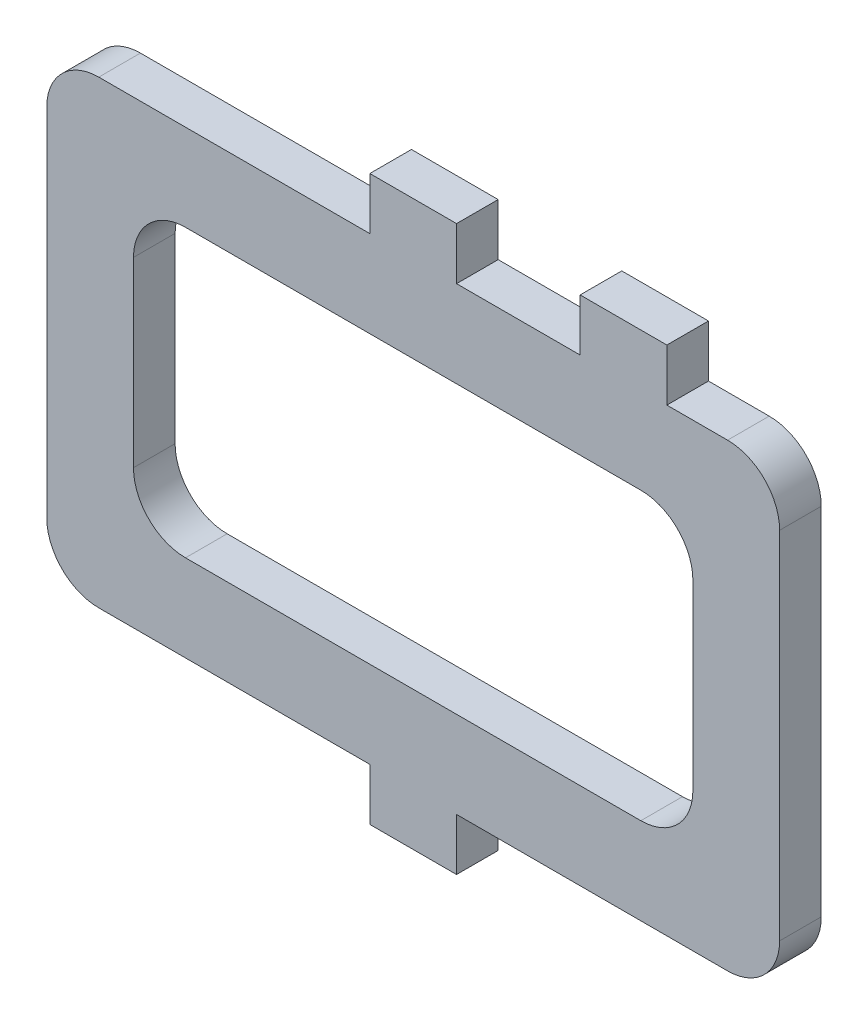
ISO-10303-21;
HEADER;
FILE_DESCRIPTION(('STEP AP214'),'2;1');
FILE_NAME('part.step','',(''),(''),'','','');
FILE_SCHEMA(('AUTOMOTIVE_DESIGN { 1 0 10303 214 1 1 1 1 }'));
ENDSEC;
DATA;
#1=APPLICATION_CONTEXT('core data for automotive mechanical design processes');
#2=APPLICATION_PROTOCOL_DEFINITION('international standard','automotive_design',2000,#1);
#3=PRODUCT_CONTEXT('',#1,'mechanical');
#4=PRODUCT('Part','Part','',(#3));
#5=PRODUCT_RELATED_PRODUCT_CATEGORY('part','',(#4));
#6=PRODUCT_DEFINITION_FORMATION('','',#4);
#7=PRODUCT_DEFINITION_CONTEXT('part definition',#1,'design');
#8=PRODUCT_DEFINITION('design','',#6,#7);
#9=PRODUCT_DEFINITION_SHAPE('','',#8);
#10=(LENGTH_UNIT() NAMED_UNIT(*) SI_UNIT(.MILLI.,.METRE.));
#11=(NAMED_UNIT(*) PLANE_ANGLE_UNIT() SI_UNIT($,.RADIAN.));
#12=(NAMED_UNIT(*) SI_UNIT($,.STERADIAN.) SOLID_ANGLE_UNIT());
#13=UNCERTAINTY_MEASURE_WITH_UNIT(LENGTH_MEASURE(1.E-05),#10,'distance_accuracy_value','');
#14=(GEOMETRIC_REPRESENTATION_CONTEXT(3) GLOBAL_UNCERTAINTY_ASSIGNED_CONTEXT((#13)) GLOBAL_UNIT_ASSIGNED_CONTEXT((#10,
#11,#12)) REPRESENTATION_CONTEXT('',''));
#15=CARTESIAN_POINT('',(0.,0.,0.));
#16=DIRECTION('',(0.,0.,1.));
#17=DIRECTION('',(1.,0.,0.));
#18=AXIS2_PLACEMENT_3D('',#15,#16,#17);
#19=CARTESIAN_POINT('',(-123.240102367902,-87.7219528240552,2.4));
#20=DIRECTION('',(0.,0.,-1.));
#21=DIRECTION('',(-1.,0.,0.));
#22=AXIS2_PLACEMENT_3D('',#19,#20,#21);
#23=CYLINDRICAL_SURFACE('',#22,3.);
#24=CARTESIAN_POINT('',(-123.240102367902,-87.7219528240552,0.));
#25=DIRECTION('',(0.,0.,1.));
#26=DIRECTION('',(1.,0.,0.));
#27=AXIS2_PLACEMENT_3D('',#24,#25,#26);
#28=CIRCLE('',#27,3.);
#29=CARTESIAN_POINT('',(-126.240102367902,-87.7219528240552,0.));
#30=VERTEX_POINT('',#29);
#31=CARTESIAN_POINT('',(-123.240102367902,-90.7219528240552,0.));
#32=VERTEX_POINT('',#31);
#33=EDGE_CURVE('E256',#30,#32,#28,.T.);
#34=ORIENTED_EDGE('',*,*,#33,.T.);
#35=DIRECTION('',(0.,0.,-1.));
#36=VECTOR('',#35,1.);
#37=CARTESIAN_POINT('',(-123.240102367902,-90.7219528240552,2.4));
#38=LINE('',#37,#36);
#39=CARTESIAN_POINT('',(-123.240102367902,-90.7219528240552,2.4));
#40=VERTEX_POINT('',#39);
#41=EDGE_CURVE('E406',#40,#32,#38,.T.);
#42=ORIENTED_EDGE('',*,*,#41,.F.);
#43=CARTESIAN_POINT('',(-123.240102367902,-87.7219528240552,2.4));
#44=DIRECTION('',(0.,0.,1.));
#45=DIRECTION('',(1.,0.,0.));
#46=AXIS2_PLACEMENT_3D('',#43,#44,#45);
#47=CIRCLE('',#46,3.);
#48=CARTESIAN_POINT('',(-126.240102367902,-87.7219528240552,2.4));
#49=VERTEX_POINT('',#48);
#50=EDGE_CURVE('E267',#49,#40,#47,.T.);
#51=ORIENTED_EDGE('',*,*,#50,.F.);
#52=DIRECTION('',(0.,0.,-1.));
#53=VECTOR('',#52,1.);
#54=CARTESIAN_POINT('',(-126.240102367902,-87.7219528240552,2.4));
#55=LINE('',#54,#53);
#56=EDGE_CURVE('E309',#49,#30,#55,.T.);
#57=ORIENTED_EDGE('',*,*,#56,.T.);
#58=EDGE_LOOP('',(#34,#42,#51,#57));
#59=FACE_BOUND('',#58,.T.);
#60=ADVANCED_FACE('F33',(#59),#23,.T.);
#61=CARTESIAN_POINT('',(-107.615102367902,-90.7219528240552,2.4));
#62=DIRECTION('',(0.,1.,0.));
#63=DIRECTION('',(0.,0.,1.));
#64=AXIS2_PLACEMENT_3D('',#61,#62,#63);
#65=PLANE('',#64);
#66=DIRECTION('',(1.,0.,0.));
#67=VECTOR('',#66,1.);
#68=CARTESIAN_POINT('',(-107.615102367902,-90.7219528240552,0.));
#69=LINE('',#68,#67);
#70=CARTESIAN_POINT('',(-107.615102367902,-90.7219528240552,0.));
#71=VERTEX_POINT('',#70);
#72=EDGE_CURVE('E312',#32,#71,#69,.T.);
#73=ORIENTED_EDGE('',*,*,#72,.T.);
#74=DIRECTION('',(0.,0.,-1.));
#75=VECTOR('',#74,1.);
#76=CARTESIAN_POINT('',(-107.615102367902,-90.7219528240552,2.4));
#77=LINE('',#76,#75);
#78=CARTESIAN_POINT('',(-107.615102367902,-90.7219528240552,2.4));
#79=VERTEX_POINT('',#78);
#80=EDGE_CURVE('E403',#79,#71,#77,.T.);
#81=ORIENTED_EDGE('',*,*,#80,.F.);
#82=DIRECTION('',(1.,0.,0.));
#83=VECTOR('',#82,1.);
#84=CARTESIAN_POINT('',(-107.615102367902,-90.7219528240552,2.4));
#85=LINE('',#84,#83);
#86=EDGE_CURVE('E270',#40,#79,#85,.T.);
#87=ORIENTED_EDGE('',*,*,#86,.F.);
#88=ORIENTED_EDGE('',*,*,#41,.T.);
#89=EDGE_LOOP('',(#73,#81,#87,#88));
#90=FACE_BOUND('',#89,.T.);
#91=ADVANCED_FACE('F457',(#90),#65,.F.);
#92=CARTESIAN_POINT('',(-107.615102367902,-90.7219528240552,2.4));
#93=DIRECTION('',(1.,0.,0.));
#94=DIRECTION('',(0.,0.,-1.));
#95=AXIS2_PLACEMENT_3D('',#92,#93,#94);
#96=PLANE('',#95);
#97=DIRECTION('',(0.,-1.,0.));
#98=VECTOR('',#97,1.);
#99=CARTESIAN_POINT('',(-107.615102367902,-90.7219528240552,0.));
#100=LINE('',#99,#98);
#101=CARTESIAN_POINT('',(-107.615102367902,-93.7219528240552,0.));
#102=VERTEX_POINT('',#101);
#103=EDGE_CURVE('E314',#71,#102,#100,.T.);
#104=ORIENTED_EDGE('',*,*,#103,.T.);
#105=DIRECTION('',(0.,0.,-1.));
#106=VECTOR('',#105,1.);
#107=CARTESIAN_POINT('',(-107.615102367902,-93.7219528240552,2.4));
#108=LINE('',#107,#106);
#109=CARTESIAN_POINT('',(-107.615102367902,-93.7219528240552,2.4));
#110=VERTEX_POINT('',#109);
#111=EDGE_CURVE('E400',#110,#102,#108,.T.);
#112=ORIENTED_EDGE('',*,*,#111,.F.);
#113=DIRECTION('',(0.,-1.,0.));
#114=VECTOR('',#113,1.);
#115=CARTESIAN_POINT('',(-107.615102367902,-90.7219528240552,2.4));
#116=LINE('',#115,#114);
#117=EDGE_CURVE('E273',#79,#110,#116,.T.);
#118=ORIENTED_EDGE('',*,*,#117,.F.);
#119=ORIENTED_EDGE('',*,*,#80,.T.);
#120=EDGE_LOOP('',(#104,#112,#118,#119));
#121=FACE_BOUND('',#120,.T.);
#122=ADVANCED_FACE('F462',(#121),#96,.F.);
#123=CARTESIAN_POINT('',(-107.615102367902,-93.7219528240552,2.4));
#124=DIRECTION('',(0.,1.,0.));
#125=DIRECTION('',(0.,0.,1.));
#126=AXIS2_PLACEMENT_3D('',#123,#124,#125);
#127=PLANE('',#126);
#128=DIRECTION('',(1.,0.,0.));
#129=VECTOR('',#128,1.);
#130=CARTESIAN_POINT('',(-107.615102367902,-93.7219528240552,0.));
#131=LINE('',#130,#129);
#132=CARTESIAN_POINT('',(-102.615102367902,-93.7219528240552,0.));
#133=VERTEX_POINT('',#132);
#134=EDGE_CURVE('E316',#102,#133,#131,.T.);
#135=ORIENTED_EDGE('',*,*,#134,.T.);
#136=DIRECTION('',(0.,0.,-1.));
#137=VECTOR('',#136,1.);
#138=CARTESIAN_POINT('',(-102.615102367902,-93.7219528240552,2.4));
#139=LINE('',#138,#137);
#140=CARTESIAN_POINT('',(-102.615102367902,-93.7219528240552,2.4));
#141=VERTEX_POINT('',#140);
#142=EDGE_CURVE('E397',#141,#133,#139,.T.);
#143=ORIENTED_EDGE('',*,*,#142,.F.);
#144=DIRECTION('',(1.,0.,0.));
#145=VECTOR('',#144,1.);
#146=CARTESIAN_POINT('',(-107.615102367902,-93.7219528240552,2.4));
#147=LINE('',#146,#145);
#148=EDGE_CURVE('E275',#110,#141,#147,.T.);
#149=ORIENTED_EDGE('',*,*,#148,.F.);
#150=ORIENTED_EDGE('',*,*,#111,.T.);
#151=EDGE_LOOP('',(#135,#143,#149,#150));
#152=FACE_BOUND('',#151,.T.);
#153=ADVANCED_FACE('F552',(#152),#127,.F.);
#154=CARTESIAN_POINT('',(-102.615102367902,-93.7219528240552,2.4));
#155=DIRECTION('',(-1.,0.,0.));
#156=DIRECTION('',(0.,0.,1.));
#157=AXIS2_PLACEMENT_3D('',#154,#155,#156);
#158=PLANE('',#157);
#159=DIRECTION('',(0.,1.,0.));
#160=VECTOR('',#159,1.);
#161=CARTESIAN_POINT('',(-102.615102367902,-93.7219528240552,0.));
#162=LINE('',#161,#160);
#163=CARTESIAN_POINT('',(-102.615102367902,-90.7219528240552,0.));
#164=VERTEX_POINT('',#163);
#165=EDGE_CURVE('E318',#133,#164,#162,.T.);
#166=ORIENTED_EDGE('',*,*,#165,.T.);
#167=DIRECTION('',(0.,0.,-1.));
#168=VECTOR('',#167,1.);
#169=CARTESIAN_POINT('',(-102.615102367902,-90.7219528240552,2.4));
#170=LINE('',#169,#168);
#171=CARTESIAN_POINT('',(-102.615102367902,-90.7219528240552,2.4));
#172=VERTEX_POINT('',#171);
#173=EDGE_CURVE('E394',#172,#164,#170,.T.);
#174=ORIENTED_EDGE('',*,*,#173,.F.);
#175=DIRECTION('',(0.,1.,0.));
#176=VECTOR('',#175,1.);
#177=CARTESIAN_POINT('',(-102.615102367902,-93.7219528240552,2.4));
#178=LINE('',#177,#176);
#179=EDGE_CURVE('E277',#141,#172,#178,.T.);
#180=ORIENTED_EDGE('',*,*,#179,.F.);
#181=ORIENTED_EDGE('',*,*,#142,.T.);
#182=EDGE_LOOP('',(#166,#174,#180,#181));
#183=FACE_BOUND('',#182,.T.);
#184=ADVANCED_FACE('F549',(#183),#158,.F.);
#185=CARTESIAN_POINT('',(-102.615102367902,-90.7219528240552,2.4));
#186=DIRECTION('',(0.,1.,0.));
#187=DIRECTION('',(0.,0.,1.));
#188=AXIS2_PLACEMENT_3D('',#185,#186,#187);
#189=PLANE('',#188);
#190=DIRECTION('',(1.,0.,0.));
#191=VECTOR('',#190,1.);
#192=CARTESIAN_POINT('',(-102.615102367902,-90.7219528240552,0.));
#193=LINE('',#192,#191);
#194=CARTESIAN_POINT('',(-86.9901023679022,-90.7219528240552,0.));
#195=VERTEX_POINT('',#194);
#196=EDGE_CURVE('E320',#164,#195,#193,.T.);
#197=ORIENTED_EDGE('',*,*,#196,.T.);
#198=DIRECTION('',(0.,0.,-1.));
#199=VECTOR('',#198,1.);
#200=CARTESIAN_POINT('',(-86.9901023679022,-90.7219528240552,2.4));
#201=LINE('',#200,#199);
#202=CARTESIAN_POINT('',(-86.9901023679022,-90.7219528240552,2.4));
#203=VERTEX_POINT('',#202);
#204=EDGE_CURVE('E391',#203,#195,#201,.T.);
#205=ORIENTED_EDGE('',*,*,#204,.F.);
#206=DIRECTION('',(1.,0.,0.));
#207=VECTOR('',#206,1.);
#208=CARTESIAN_POINT('',(-102.615102367902,-90.7219528240552,2.4));
#209=LINE('',#208,#207);
#210=EDGE_CURVE('E279',#172,#203,#209,.T.);
#211=ORIENTED_EDGE('',*,*,#210,.F.);
#212=ORIENTED_EDGE('',*,*,#173,.T.);
#213=EDGE_LOOP('',(#197,#205,#211,#212));
#214=FACE_BOUND('',#213,.T.);
#215=ADVANCED_FACE('F545',(#214),#189,.F.);
#216=CARTESIAN_POINT('',(-86.9901023679022,-87.7219528240552,2.4));
#217=DIRECTION('',(0.,0.,-1.));
#218=DIRECTION('',(-1.,0.,0.));
#219=AXIS2_PLACEMENT_3D('',#216,#217,#218);
#220=CYLINDRICAL_SURFACE('',#219,3.);
#221=CARTESIAN_POINT('',(-86.9901023679022,-87.7219528240552,0.));
#222=DIRECTION('',(0.,0.,1.));
#223=DIRECTION('',(1.,0.,0.));
#224=AXIS2_PLACEMENT_3D('',#221,#222,#223);
#225=CIRCLE('',#224,3.);
#226=CARTESIAN_POINT('',(-83.9901023679022,-87.7219528240552,0.));
#227=VERTEX_POINT('',#226);
#228=EDGE_CURVE('E322',#195,#227,#225,.T.);
#229=ORIENTED_EDGE('',*,*,#228,.T.);
#230=DIRECTION('',(0.,0.,-1.));
#231=VECTOR('',#230,1.);
#232=CARTESIAN_POINT('',(-83.9901023679022,-87.7219528240552,2.4));
#233=LINE('',#232,#231);
#234=CARTESIAN_POINT('',(-83.9901023679022,-87.7219528240552,2.4));
#235=VERTEX_POINT('',#234);
#236=EDGE_CURVE('E388',#235,#227,#233,.T.);
#237=ORIENTED_EDGE('',*,*,#236,.F.);
#238=CARTESIAN_POINT('',(-86.9901023679022,-87.7219528240552,2.4));
#239=DIRECTION('',(0.,0.,1.));
#240=DIRECTION('',(1.,0.,0.));
#241=AXIS2_PLACEMENT_3D('',#238,#239,#240);
#242=CIRCLE('',#241,3.);
#243=EDGE_CURVE('E281',#203,#235,#242,.T.);
#244=ORIENTED_EDGE('',*,*,#243,.F.);
#245=ORIENTED_EDGE('',*,*,#204,.T.);
#246=EDGE_LOOP('',(#229,#237,#244,#245));
#247=FACE_BOUND('',#246,.T.);
#248=ADVANCED_FACE('F540',(#247),#220,.T.);
#249=CARTESIAN_POINT('',(-83.9901023679022,-87.7219528240552,2.4));
#250=DIRECTION('',(-1.,0.,0.));
#251=DIRECTION('',(0.,-1.,0.));
#252=AXIS2_PLACEMENT_3D('',#249,#250,#251);
#253=PLANE('',#252);
#254=DIRECTION('',(0.,1.,0.));
#255=VECTOR('',#254,1.);
#256=CARTESIAN_POINT('',(-83.9901023679022,-87.7219528240552,0.));
#257=LINE('',#256,#255);
#258=CARTESIAN_POINT('',(-83.9901023679022,-67.2219528240552,0.));
#259=VERTEX_POINT('',#258);
#260=EDGE_CURVE('E324',#227,#259,#257,.T.);
#261=ORIENTED_EDGE('',*,*,#260,.T.);
#262=DIRECTION('',(0.,0.,-1.));
#263=VECTOR('',#262,1.);
#264=CARTESIAN_POINT('',(-83.9901023679022,-67.2219528240552,2.4));
#265=LINE('',#264,#263);
#266=CARTESIAN_POINT('',(-83.9901023679022,-67.2219528240552,2.4));
#267=VERTEX_POINT('',#266);
#268=EDGE_CURVE('E385',#267,#259,#265,.T.);
#269=ORIENTED_EDGE('',*,*,#268,.F.);
#270=DIRECTION('',(0.,1.,0.));
#271=VECTOR('',#270,1.);
#272=CARTESIAN_POINT('',(-83.9901023679022,-87.7219528240552,2.4));
#273=LINE('',#272,#271);
#274=EDGE_CURVE('E283',#235,#267,#273,.T.);
#275=ORIENTED_EDGE('',*,*,#274,.F.);
#276=ORIENTED_EDGE('',*,*,#236,.T.);
#277=EDGE_LOOP('',(#261,#269,#275,#276));
#278=FACE_BOUND('',#277,.T.);
#279=ADVANCED_FACE('F534',(#278),#253,.F.);
#280=CARTESIAN_POINT('',(-86.9901023679022,-67.2219528240552,2.4));
#281=DIRECTION('',(0.,0.,-1.));
#282=DIRECTION('',(-1.,0.,0.));
#283=AXIS2_PLACEMENT_3D('',#280,#281,#282);
#284=CYLINDRICAL_SURFACE('',#283,3.);
#285=CARTESIAN_POINT('',(-86.9901023679022,-67.2219528240552,0.));
#286=DIRECTION('',(0.,0.,1.));
#287=DIRECTION('',(1.,0.,0.));
#288=AXIS2_PLACEMENT_3D('',#285,#286,#287);
#289=CIRCLE('',#288,3.);
#290=CARTESIAN_POINT('',(-86.9901023679022,-64.2219528240552,0.));
#291=VERTEX_POINT('',#290);
#292=EDGE_CURVE('E326',#259,#291,#289,.T.);
#293=ORIENTED_EDGE('',*,*,#292,.T.);
#294=DIRECTION('',(0.,0.,-1.));
#295=VECTOR('',#294,1.);
#296=CARTESIAN_POINT('',(-86.9901023679022,-64.2219528240552,2.4));
#297=LINE('',#296,#295);
#298=CARTESIAN_POINT('',(-86.9901023679022,-64.2219528240552,2.4));
#299=VERTEX_POINT('',#298);
#300=EDGE_CURVE('E382',#299,#291,#297,.T.);
#301=ORIENTED_EDGE('',*,*,#300,.F.);
#302=CARTESIAN_POINT('',(-86.9901023679022,-67.2219528240552,2.4));
#303=DIRECTION('',(0.,0.,1.));
#304=DIRECTION('',(1.,0.,0.));
#305=AXIS2_PLACEMENT_3D('',#302,#303,#304);
#306=CIRCLE('',#305,3.);
#307=EDGE_CURVE('E285',#267,#299,#306,.T.);
#308=ORIENTED_EDGE('',*,*,#307,.F.);
#309=ORIENTED_EDGE('',*,*,#268,.T.);
#310=EDGE_LOOP('',(#293,#301,#308,#309));
#311=FACE_BOUND('',#310,.T.);
#312=ADVANCED_FACE('F530',(#311),#284,.T.);
#313=CARTESIAN_POINT('',(-90.4901023679022,-64.2219528240552,2.4));
#314=DIRECTION('',(0.,-1.,0.));
#315=DIRECTION('',(0.,0.,-1.));
#316=AXIS2_PLACEMENT_3D('',#313,#314,#315);
#317=PLANE('',#316);
#318=DIRECTION('',(-1.,0.,0.));
#319=VECTOR('',#318,1.);
#320=CARTESIAN_POINT('',(-90.4901023679022,-64.2219528240552,0.));
#321=LINE('',#320,#319);
#322=CARTESIAN_POINT('',(-90.4901023679022,-64.2219528240552,0.));
#323=VERTEX_POINT('',#322);
#324=EDGE_CURVE('E328',#291,#323,#321,.T.);
#325=ORIENTED_EDGE('',*,*,#324,.T.);
#326=DIRECTION('',(0.,0.,-1.));
#327=VECTOR('',#326,1.);
#328=CARTESIAN_POINT('',(-90.4901023679022,-64.2219528240552,2.4));
#329=LINE('',#328,#327);
#330=CARTESIAN_POINT('',(-90.4901023679022,-64.2219528240552,2.4));
#331=VERTEX_POINT('',#330);
#332=EDGE_CURVE('E379',#331,#323,#329,.T.);
#333=ORIENTED_EDGE('',*,*,#332,.F.);
#334=DIRECTION('',(-1.,0.,0.));
#335=VECTOR('',#334,1.);
#336=CARTESIAN_POINT('',(-90.4901023679022,-64.2219528240552,2.4));
#337=LINE('',#336,#335);
#338=EDGE_CURVE('E287',#299,#331,#337,.T.);
#339=ORIENTED_EDGE('',*,*,#338,.F.);
#340=ORIENTED_EDGE('',*,*,#300,.T.);
#341=EDGE_LOOP('',(#325,#333,#339,#340));
#342=FACE_BOUND('',#341,.T.);
#343=ADVANCED_FACE('F525',(#342),#317,.F.);
#344=CARTESIAN_POINT('',(-90.4901023679022,-61.2219528240552,2.4));
#345=DIRECTION('',(-1.,0.,0.));
#346=DIRECTION('',(0.,0.,1.));
#347=AXIS2_PLACEMENT_3D('',#344,#345,#346);
#348=PLANE('',#347);
#349=DIRECTION('',(0.,1.,0.));
#350=VECTOR('',#349,1.);
#351=CARTESIAN_POINT('',(-90.4901023679022,-61.2219528240552,0.));
#352=LINE('',#351,#350);
#353=CARTESIAN_POINT('',(-90.4901023679022,-61.2219528240552,0.));
#354=VERTEX_POINT('',#353);
#355=EDGE_CURVE('E330',#323,#354,#352,.T.);
#356=ORIENTED_EDGE('',*,*,#355,.T.);
#357=DIRECTION('',(0.,0.,-1.));
#358=VECTOR('',#357,1.);
#359=CARTESIAN_POINT('',(-90.4901023679022,-61.2219528240552,2.4));
#360=LINE('',#359,#358);
#361=CARTESIAN_POINT('',(-90.4901023679022,-61.2219528240552,2.4));
#362=VERTEX_POINT('',#361);
#363=EDGE_CURVE('E376',#362,#354,#360,.T.);
#364=ORIENTED_EDGE('',*,*,#363,.F.);
#365=DIRECTION('',(0.,1.,0.));
#366=VECTOR('',#365,1.);
#367=CARTESIAN_POINT('',(-90.4901023679022,-61.2219528240552,2.4));
#368=LINE('',#367,#366);
#369=EDGE_CURVE('E289',#331,#362,#368,.T.);
#370=ORIENTED_EDGE('',*,*,#369,.F.);
#371=ORIENTED_EDGE('',*,*,#332,.T.);
#372=EDGE_LOOP('',(#356,#364,#370,#371));
#373=FACE_BOUND('',#372,.T.);
#374=ADVANCED_FACE('F519',(#373),#348,.F.);
#375=CARTESIAN_POINT('',(-95.4901023679022,-61.2219528240552,2.4));
#376=DIRECTION('',(0.,-1.,0.));
#377=DIRECTION('',(0.,0.,-1.));
#378=AXIS2_PLACEMENT_3D('',#375,#376,#377);
#379=PLANE('',#378);
#380=DIRECTION('',(-1.,0.,0.));
#381=VECTOR('',#380,1.);
#382=CARTESIAN_POINT('',(-95.4901023679022,-61.2219528240552,0.));
#383=LINE('',#382,#381);
#384=CARTESIAN_POINT('',(-95.4901023679022,-61.2219528240552,0.));
#385=VERTEX_POINT('',#384);
#386=EDGE_CURVE('E332',#354,#385,#383,.T.);
#387=ORIENTED_EDGE('',*,*,#386,.T.);
#388=DIRECTION('',(0.,0.,-1.));
#389=VECTOR('',#388,1.);
#390=CARTESIAN_POINT('',(-95.4901023679022,-61.2219528240552,2.4));
#391=LINE('',#390,#389);
#392=CARTESIAN_POINT('',(-95.4901023679022,-61.2219528240552,2.4));
#393=VERTEX_POINT('',#392);
#394=EDGE_CURVE('E373',#393,#385,#391,.T.);
#395=ORIENTED_EDGE('',*,*,#394,.F.);
#396=DIRECTION('',(-1.,0.,0.));
#397=VECTOR('',#396,1.);
#398=CARTESIAN_POINT('',(-95.4901023679022,-61.2219528240552,2.4));
#399=LINE('',#398,#397);
#400=EDGE_CURVE('E291',#362,#393,#399,.T.);
#401=ORIENTED_EDGE('',*,*,#400,.F.);
#402=ORIENTED_EDGE('',*,*,#363,.T.);
#403=EDGE_LOOP('',(#387,#395,#401,#402));
#404=FACE_BOUND('',#403,.T.);
#405=ADVANCED_FACE('F515',(#404),#379,.F.);
#406=CARTESIAN_POINT('',(-95.4901023679022,-61.2219528240552,2.4));
#407=DIRECTION('',(1.,0.,0.));
#408=DIRECTION('',(0.,0.,-1.));
#409=AXIS2_PLACEMENT_3D('',#406,#407,#408);
#410=PLANE('',#409);
#411=DIRECTION('',(0.,-1.,0.));
#412=VECTOR('',#411,1.);
#413=CARTESIAN_POINT('',(-95.4901023679022,-61.2219528240552,0.));
#414=LINE('',#413,#412);
#415=CARTESIAN_POINT('',(-95.4901023679022,-64.2219528240552,0.));
#416=VERTEX_POINT('',#415);
#417=EDGE_CURVE('E334',#385,#416,#414,.T.);
#418=ORIENTED_EDGE('',*,*,#417,.T.);
#419=DIRECTION('',(0.,0.,-1.));
#420=VECTOR('',#419,1.);
#421=CARTESIAN_POINT('',(-95.4901023679022,-64.2219528240552,2.4));
#422=LINE('',#421,#420);
#423=CARTESIAN_POINT('',(-95.4901023679022,-64.2219528240552,2.4));
#424=VERTEX_POINT('',#423);
#425=EDGE_CURVE('E370',#424,#416,#422,.T.);
#426=ORIENTED_EDGE('',*,*,#425,.F.);
#427=DIRECTION('',(0.,-1.,0.));
#428=VECTOR('',#427,1.);
#429=CARTESIAN_POINT('',(-95.4901023679022,-61.2219528240552,2.4));
#430=LINE('',#429,#428);
#431=EDGE_CURVE('E293',#393,#424,#430,.T.);
#432=ORIENTED_EDGE('',*,*,#431,.F.);
#433=ORIENTED_EDGE('',*,*,#394,.T.);
#434=EDGE_LOOP('',(#418,#426,#432,#433));
#435=FACE_BOUND('',#434,.T.);
#436=ADVANCED_FACE('F510',(#435),#410,.F.);
#437=CARTESIAN_POINT('',(-95.4901023679022,-64.2219528240552,2.4));
#438=DIRECTION('',(0.,-1.,0.));
#439=DIRECTION('',(0.,0.,-1.));
#440=AXIS2_PLACEMENT_3D('',#437,#438,#439);
#441=PLANE('',#440);
#442=DIRECTION('',(-1.,0.,0.));
#443=VECTOR('',#442,1.);
#444=CARTESIAN_POINT('',(-95.4901023679022,-64.2219528240552,0.));
#445=LINE('',#444,#443);
#446=CARTESIAN_POINT('',(-102.615102367902,-64.2219528240552,0.));
#447=VERTEX_POINT('',#446);
#448=EDGE_CURVE('E336',#416,#447,#445,.T.);
#449=ORIENTED_EDGE('',*,*,#448,.T.);
#450=DIRECTION('',(0.,0.,-1.));
#451=VECTOR('',#450,1.);
#452=CARTESIAN_POINT('',(-102.615102367902,-64.2219528240552,2.4));
#453=LINE('',#452,#451);
#454=CARTESIAN_POINT('',(-102.615102367902,-64.2219528240552,2.4));
#455=VERTEX_POINT('',#454);
#456=EDGE_CURVE('E367',#455,#447,#453,.T.);
#457=ORIENTED_EDGE('',*,*,#456,.F.);
#458=DIRECTION('',(-1.,0.,0.));
#459=VECTOR('',#458,1.);
#460=CARTESIAN_POINT('',(-95.4901023679022,-64.2219528240552,2.4));
#461=LINE('',#460,#459);
#462=EDGE_CURVE('E295',#424,#455,#461,.T.);
#463=ORIENTED_EDGE('',*,*,#462,.F.);
#464=ORIENTED_EDGE('',*,*,#425,.T.);
#465=EDGE_LOOP('',(#449,#457,#463,#464));
#466=FACE_BOUND('',#465,.T.);
#467=ADVANCED_FACE('F504',(#466),#441,.F.);
#468=CARTESIAN_POINT('',(-102.615102367902,-61.2219528240552,2.4));
#469=DIRECTION('',(-1.,0.,0.));
#470=DIRECTION('',(0.,0.,1.));
#471=AXIS2_PLACEMENT_3D('',#468,#469,#470);
#472=PLANE('',#471);
#473=DIRECTION('',(0.,1.,0.));
#474=VECTOR('',#473,1.);
#475=CARTESIAN_POINT('',(-102.615102367902,-61.2219528240552,0.));
#476=LINE('',#475,#474);
#477=CARTESIAN_POINT('',(-102.615102367902,-61.2219528240552,0.));
#478=VERTEX_POINT('',#477);
#479=EDGE_CURVE('E338',#447,#478,#476,.T.);
#480=ORIENTED_EDGE('',*,*,#479,.T.);
#481=DIRECTION('',(0.,0.,-1.));
#482=VECTOR('',#481,1.);
#483=CARTESIAN_POINT('',(-102.615102367902,-61.2219528240552,2.4));
#484=LINE('',#483,#482);
#485=CARTESIAN_POINT('',(-102.615102367902,-61.2219528240552,2.4));
#486=VERTEX_POINT('',#485);
#487=EDGE_CURVE('E364',#486,#478,#484,.T.);
#488=ORIENTED_EDGE('',*,*,#487,.F.);
#489=DIRECTION('',(0.,1.,0.));
#490=VECTOR('',#489,1.);
#491=CARTESIAN_POINT('',(-102.615102367902,-61.2219528240552,2.4));
#492=LINE('',#491,#490);
#493=EDGE_CURVE('E297',#455,#486,#492,.T.);
#494=ORIENTED_EDGE('',*,*,#493,.F.);
#495=ORIENTED_EDGE('',*,*,#456,.T.);
#496=EDGE_LOOP('',(#480,#488,#494,#495));
#497=FACE_BOUND('',#496,.T.);
#498=ADVANCED_FACE('F499',(#497),#472,.F.);
#499=CARTESIAN_POINT('',(-107.615102367902,-61.2219528240552,2.4));
#500=DIRECTION('',(0.,-1.,0.));
#501=DIRECTION('',(0.,0.,-1.));
#502=AXIS2_PLACEMENT_3D('',#499,#500,#501);
#503=PLANE('',#502);
#504=DIRECTION('',(-1.,0.,0.));
#505=VECTOR('',#504,1.);
#506=CARTESIAN_POINT('',(-107.615102367902,-61.2219528240552,0.));
#507=LINE('',#506,#505);
#508=CARTESIAN_POINT('',(-107.615102367902,-61.2219528240552,0.));
#509=VERTEX_POINT('',#508);
#510=EDGE_CURVE('E341',#478,#509,#507,.T.);
#511=ORIENTED_EDGE('',*,*,#510,.T.);
#512=DIRECTION('',(0.,0.,-1.));
#513=VECTOR('',#512,1.);
#514=CARTESIAN_POINT('',(-107.615102367902,-61.2219528240552,2.4));
#515=LINE('',#514,#513);
#516=CARTESIAN_POINT('',(-107.615102367902,-61.2219528240552,2.4));
#517=VERTEX_POINT('',#516);
#518=EDGE_CURVE('E361',#517,#509,#515,.T.);
#519=ORIENTED_EDGE('',*,*,#518,.F.);
#520=DIRECTION('',(-1.,0.,0.));
#521=VECTOR('',#520,1.);
#522=CARTESIAN_POINT('',(-105.115102367902,-61.2219528240552,2.4));
#523=LINE('',#522,#521);
#524=EDGE_CURVE('E299',#486,#517,#523,.T.);
#525=ORIENTED_EDGE('',*,*,#524,.F.);
#526=ORIENTED_EDGE('',*,*,#487,.T.);
#527=EDGE_LOOP('',(#511,#519,#525,#526));
#528=FACE_BOUND('',#527,.T.);
#529=ADVANCED_FACE('F494',(#528),#503,.F.);
#530=CARTESIAN_POINT('',(-107.615102367902,-61.2219528240552,2.4));
#531=DIRECTION('',(1.,0.,0.));
#532=DIRECTION('',(0.,0.,-1.));
#533=AXIS2_PLACEMENT_3D('',#530,#531,#532);
#534=PLANE('',#533);
#535=DIRECTION('',(0.,-1.,0.));
#536=VECTOR('',#535,1.);
#537=CARTESIAN_POINT('',(-107.615102367902,-61.2219528240552,0.));
#538=LINE('',#537,#536);
#539=CARTESIAN_POINT('',(-107.615102367902,-64.2219528240552,0.));
#540=VERTEX_POINT('',#539);
#541=EDGE_CURVE('E343',#509,#540,#538,.T.);
#542=ORIENTED_EDGE('',*,*,#541,.T.);
#543=DIRECTION('',(0.,0.,-1.));
#544=VECTOR('',#543,1.);
#545=CARTESIAN_POINT('',(-107.615102367902,-64.2219528240552,2.4));
#546=LINE('',#545,#544);
#547=CARTESIAN_POINT('',(-107.615102367902,-64.2219528240552,2.4));
#548=VERTEX_POINT('',#547);
#549=EDGE_CURVE('E358',#548,#540,#546,.T.);
#550=ORIENTED_EDGE('',*,*,#549,.F.);
#551=DIRECTION('',(0.,-1.,0.));
#552=VECTOR('',#551,1.);
#553=CARTESIAN_POINT('',(-107.615102367902,-61.2219528240552,2.4));
#554=LINE('',#553,#552);
#555=EDGE_CURVE('E301',#517,#548,#554,.T.);
#556=ORIENTED_EDGE('',*,*,#555,.F.);
#557=ORIENTED_EDGE('',*,*,#518,.T.);
#558=EDGE_LOOP('',(#542,#550,#556,#557));
#559=FACE_BOUND('',#558,.T.);
#560=ADVANCED_FACE('F490',(#559),#534,.F.);
#561=CARTESIAN_POINT('',(-123.240102367902,-64.2219528240552,2.4));
#562=DIRECTION('',(0.,-1.,0.));
#563=DIRECTION('',(0.,0.,-1.));
#564=AXIS2_PLACEMENT_3D('',#561,#562,#563);
#565=PLANE('',#564);
#566=DIRECTION('',(-1.,0.,0.));
#567=VECTOR('',#566,1.);
#568=CARTESIAN_POINT('',(-123.240102367902,-64.2219528240552,0.));
#569=LINE('',#568,#567);
#570=CARTESIAN_POINT('',(-123.240102367902,-64.2219528240552,0.));
#571=VERTEX_POINT('',#570);
#572=EDGE_CURVE('E345',#540,#571,#569,.T.);
#573=ORIENTED_EDGE('',*,*,#572,.T.);
#574=DIRECTION('',(0.,0.,-1.));
#575=VECTOR('',#574,1.);
#576=CARTESIAN_POINT('',(-123.240102367902,-64.2219528240552,2.4));
#577=LINE('',#576,#575);
#578=CARTESIAN_POINT('',(-123.240102367902,-64.2219528240552,2.4));
#579=VERTEX_POINT('',#578);
#580=EDGE_CURVE('E355',#579,#571,#577,.T.);
#581=ORIENTED_EDGE('',*,*,#580,.F.);
#582=DIRECTION('',(-1.,0.,0.));
#583=VECTOR('',#582,1.);
#584=CARTESIAN_POINT('',(-123.240102367902,-64.2219528240552,2.4));
#585=LINE('',#584,#583);
#586=EDGE_CURVE('E303',#548,#579,#585,.T.);
#587=ORIENTED_EDGE('',*,*,#586,.F.);
#588=ORIENTED_EDGE('',*,*,#549,.T.);
#589=EDGE_LOOP('',(#573,#581,#587,#588));
#590=FACE_BOUND('',#589,.T.);
#591=ADVANCED_FACE('F485',(#590),#565,.F.);
#592=CARTESIAN_POINT('',(-123.240102367902,-67.2219528240552,2.4));
#593=DIRECTION('',(0.,0.,-1.));
#594=DIRECTION('',(-1.,0.,0.));
#595=AXIS2_PLACEMENT_3D('',#592,#593,#594);
#596=CYLINDRICAL_SURFACE('',#595,3.);
#597=CARTESIAN_POINT('',(-123.240102367902,-67.2219528240552,0.));
#598=DIRECTION('',(0.,0.,1.));
#599=DIRECTION('',(-1.,0.,0.));
#600=AXIS2_PLACEMENT_3D('',#597,#598,#599);
#601=CIRCLE('',#600,3.);
#602=CARTESIAN_POINT('',(-126.240102367902,-67.2219528240552,0.));
#603=VERTEX_POINT('',#602);
#604=EDGE_CURVE('E347',#571,#603,#601,.T.);
#605=ORIENTED_EDGE('',*,*,#604,.T.);
#606=DIRECTION('',(0.,0.,-1.));
#607=VECTOR('',#606,1.);
#608=CARTESIAN_POINT('',(-126.240102367902,-67.2219528240552,2.4));
#609=LINE('',#608,#607);
#610=CARTESIAN_POINT('',(-126.240102367902,-67.2219528240552,2.4));
#611=VERTEX_POINT('',#610);
#612=EDGE_CURVE('E352',#611,#603,#609,.T.);
#613=ORIENTED_EDGE('',*,*,#612,.F.);
#614=CARTESIAN_POINT('',(-123.240102367902,-67.2219528240552,2.4));
#615=DIRECTION('',(0.,0.,1.));
#616=DIRECTION('',(-1.,0.,0.));
#617=AXIS2_PLACEMENT_3D('',#614,#615,#616);
#618=CIRCLE('',#617,3.);
#619=EDGE_CURVE('E305',#579,#611,#618,.T.);
#620=ORIENTED_EDGE('',*,*,#619,.F.);
#621=ORIENTED_EDGE('',*,*,#580,.T.);
#622=EDGE_LOOP('',(#605,#613,#620,#621));
#623=FACE_BOUND('',#622,.T.);
#624=ADVANCED_FACE('F480',(#623),#596,.T.);
#625=CARTESIAN_POINT('',(-126.240102367902,-87.7219528240552,2.4));
#626=DIRECTION('',(1.,0.,0.));
#627=DIRECTION('',(0.,0.,-1.));
#628=AXIS2_PLACEMENT_3D('',#625,#626,#627);
#629=PLANE('',#628);
#630=DIRECTION('',(0.,-1.,0.));
#631=VECTOR('',#630,1.);
#632=CARTESIAN_POINT('',(-126.240102367902,-87.7219528240552,0.));
#633=LINE('',#632,#631);
#634=EDGE_CURVE('E271',#603,#30,#633,.T.);
#635=ORIENTED_EDGE('',*,*,#634,.T.);
#636=ORIENTED_EDGE('',*,*,#56,.F.);
#637=DIRECTION('',(0.,-1.,0.));
#638=VECTOR('',#637,1.);
#639=CARTESIAN_POINT('',(-126.240102367902,-87.7219528240552,2.4));
#640=LINE('',#639,#638);
#641=EDGE_CURVE('E307',#611,#49,#640,.T.);
#642=ORIENTED_EDGE('',*,*,#641,.F.);
#643=ORIENTED_EDGE('',*,*,#612,.T.);
#644=EDGE_LOOP('',(#635,#636,#642,#643));
#645=FACE_BOUND('',#644,.T.);
#646=ADVANCED_FACE('F478',(#645),#629,.F.);
#647=CARTESIAN_POINT('',(-123.240102367902,-87.7219528240552,2.4));
#648=DIRECTION('',(0.,0.,1.));
#649=DIRECTION('',(1.,0.,0.));
#650=AXIS2_PLACEMENT_3D('',#647,#648,#649);
#651=PLANE('',#650);
#652=CARTESIAN_POINT('',(-118.240102367902,-82.7219528240552,2.4));
#653=DIRECTION('',(0.,0.,1.));
#654=DIRECTION('',(-1.,0.,0.));
#655=AXIS2_PLACEMENT_3D('',#652,#653,#654);
#656=CIRCLE('',#655,3.);
#657=CARTESIAN_POINT('',(-121.240102367902,-82.7219528240552,2.4));
#658=VERTEX_POINT('',#657);
#659=CARTESIAN_POINT('',(-118.240102367902,-85.7219528240552,2.4));
#660=VERTEX_POINT('',#659);
#661=EDGE_CURVE('E47',#658,#660,#656,.T.);
#662=ORIENTED_EDGE('',*,*,#661,.F.);
#663=DIRECTION('',(0.,-1.,0.));
#664=VECTOR('',#663,1.);
#665=CARTESIAN_POINT('',(-121.240102367902,-82.7219528240552,2.4));
#666=LINE('',#665,#664);
#667=CARTESIAN_POINT('',(-121.240102367902,-72.2219528240552,2.4));
#668=VERTEX_POINT('',#667);
#669=EDGE_CURVE('E251',#668,#658,#666,.T.);
#670=ORIENTED_EDGE('',*,*,#669,.F.);
#671=CARTESIAN_POINT('',(-118.240102367902,-72.2219528240552,2.4));
#672=DIRECTION('',(0.,0.,1.));
#673=DIRECTION('',(-1.,0.,0.));
#674=AXIS2_PLACEMENT_3D('',#671,#672,#673);
#675=CIRCLE('',#674,3.);
#676=CARTESIAN_POINT('',(-118.240102367902,-69.2219528240552,2.4));
#677=VERTEX_POINT('',#676);
#678=EDGE_CURVE('E248',#677,#668,#675,.T.);
#679=ORIENTED_EDGE('',*,*,#678,.F.);
#680=DIRECTION('',(-1.,0.,0.));
#681=VECTOR('',#680,1.);
#682=CARTESIAN_POINT('',(-118.240102367902,-69.2219528240552,2.4));
#683=LINE('',#682,#681);
#684=CARTESIAN_POINT('',(-91.9901023679022,-69.2219528240552,2.4));
#685=VERTEX_POINT('',#684);
#686=EDGE_CURVE('E245',#685,#677,#683,.T.);
#687=ORIENTED_EDGE('',*,*,#686,.F.);
#688=CARTESIAN_POINT('',(-91.9901023679022,-72.2219528240552,2.4));
#689=DIRECTION('',(0.,0.,1.));
#690=DIRECTION('',(-1.,0.,0.));
#691=AXIS2_PLACEMENT_3D('',#688,#689,#690);
#692=CIRCLE('',#691,3.);
#693=CARTESIAN_POINT('',(-88.9901023679022,-72.2219528240552,2.4));
#694=VERTEX_POINT('',#693);
#695=EDGE_CURVE('E239',#694,#685,#692,.T.);
#696=ORIENTED_EDGE('',*,*,#695,.F.);
#697=DIRECTION('',(0.,1.,0.));
#698=VECTOR('',#697,1.);
#699=CARTESIAN_POINT('',(-88.9901023679022,-72.2219528240552,2.4));
#700=LINE('',#699,#698);
#701=CARTESIAN_POINT('',(-88.9901023679022,-82.7219528240552,2.4));
#702=VERTEX_POINT('',#701);
#703=EDGE_CURVE('E237',#702,#694,#700,.T.);
#704=ORIENTED_EDGE('',*,*,#703,.F.);
#705=CARTESIAN_POINT('',(-91.9901023679022,-82.7219528240552,2.4));
#706=DIRECTION('',(0.,0.,1.));
#707=DIRECTION('',(-1.,0.,0.));
#708=AXIS2_PLACEMENT_3D('',#705,#706,#707);
#709=CIRCLE('',#708,3.);
#710=CARTESIAN_POINT('',(-91.9901023679022,-85.7219528240552,2.4));
#711=VERTEX_POINT('',#710);
#712=EDGE_CURVE('E220',#711,#702,#709,.T.);
#713=ORIENTED_EDGE('',*,*,#712,.F.);
#714=DIRECTION('',(1.,0.,0.));
#715=VECTOR('',#714,1.);
#716=CARTESIAN_POINT('',(-91.9901023679022,-85.7219528240552,2.4));
#717=LINE('',#716,#715);
#718=EDGE_CURVE('E229',#660,#711,#717,.T.);
#719=ORIENTED_EDGE('',*,*,#718,.F.);
#720=EDGE_LOOP('',(#662,#670,#679,#687,#696,#704,#713,#719));
#721=FACE_BOUND('',#720,.T.);
#722=ORIENTED_EDGE('',*,*,#50,.T.);
#723=ORIENTED_EDGE('',*,*,#86,.T.);
#724=ORIENTED_EDGE('',*,*,#117,.T.);
#725=ORIENTED_EDGE('',*,*,#148,.T.);
#726=ORIENTED_EDGE('',*,*,#179,.T.);
#727=ORIENTED_EDGE('',*,*,#210,.T.);
#728=ORIENTED_EDGE('',*,*,#243,.T.);
#729=ORIENTED_EDGE('',*,*,#274,.T.);
#730=ORIENTED_EDGE('',*,*,#307,.T.);
#731=ORIENTED_EDGE('',*,*,#338,.T.);
#732=ORIENTED_EDGE('',*,*,#369,.T.);
#733=ORIENTED_EDGE('',*,*,#400,.T.);
#734=ORIENTED_EDGE('',*,*,#431,.T.);
#735=ORIENTED_EDGE('',*,*,#462,.T.);
#736=ORIENTED_EDGE('',*,*,#493,.T.);
#737=ORIENTED_EDGE('',*,*,#524,.T.);
#738=ORIENTED_EDGE('',*,*,#555,.T.);
#739=ORIENTED_EDGE('',*,*,#586,.T.);
#740=ORIENTED_EDGE('',*,*,#619,.T.);
#741=ORIENTED_EDGE('',*,*,#641,.T.);
#742=EDGE_LOOP('',(#722,#723,#724,#725,#726,#727,#728,#729,#730,#731,#732,#733,#734,#735,#736,
#737,#738,#739,#740,#741));
#743=FACE_BOUND('',#742,.T.);
#744=ADVANCED_FACE('F233',(#721,#743),#651,.T.);
#745=CARTESIAN_POINT('',(-123.240102367902,-87.7219528240552,0.));
#746=DIRECTION('',(0.,0.,1.));
#747=DIRECTION('',(1.,0.,0.));
#748=AXIS2_PLACEMENT_3D('',#745,#746,#747);
#749=PLANE('',#748);
#750=DIRECTION('',(0.,-1.,0.));
#751=VECTOR('',#750,1.);
#752=CARTESIAN_POINT('',(-121.240102367902,-87.7219528240552,0.));
#753=LINE('',#752,#751);
#754=CARTESIAN_POINT('',(-121.240102367902,-72.2219528240552,0.));
#755=VERTEX_POINT('',#754);
#756=CARTESIAN_POINT('',(-121.240102367902,-82.7219528240552,0.));
#757=VERTEX_POINT('',#756);
#758=EDGE_CURVE('E40',#755,#757,#753,.T.);
#759=ORIENTED_EDGE('',*,*,#758,.T.);
#760=CARTESIAN_POINT('',(-118.240102367902,-82.7219528240552,0.));
#761=DIRECTION('',(0.,0.,1.));
#762=DIRECTION('',(1.,0.,0.));
#763=AXIS2_PLACEMENT_3D('',#760,#761,#762);
#764=CIRCLE('',#763,3.);
#765=CARTESIAN_POINT('',(-118.240102367902,-85.7219528240552,0.));
#766=VERTEX_POINT('',#765);
#767=EDGE_CURVE('E11',#757,#766,#764,.T.);
#768=ORIENTED_EDGE('',*,*,#767,.T.);
#769=DIRECTION('',(1.,0.,0.));
#770=VECTOR('',#769,1.);
#771=CARTESIAN_POINT('',(-123.240102367902,-85.7219528240552,0.));
#772=LINE('',#771,#770);
#773=CARTESIAN_POINT('',(-91.9901023679022,-85.7219528240552,0.));
#774=VERTEX_POINT('',#773);
#775=EDGE_CURVE('E409',#766,#774,#772,.T.);
#776=ORIENTED_EDGE('',*,*,#775,.T.);
#777=CARTESIAN_POINT('',(-91.9901023679022,-82.7219528240552,0.));
#778=DIRECTION('',(0.,0.,1.));
#779=DIRECTION('',(1.,0.,0.));
#780=AXIS2_PLACEMENT_3D('',#777,#778,#779);
#781=CIRCLE('',#780,3.);
#782=CARTESIAN_POINT('',(-88.9901023679022,-82.7219528240552,0.));
#783=VERTEX_POINT('',#782);
#784=EDGE_CURVE('E223',#774,#783,#781,.T.);
#785=ORIENTED_EDGE('',*,*,#784,.T.);
#786=DIRECTION('',(0.,1.,0.));
#787=VECTOR('',#786,1.);
#788=CARTESIAN_POINT('',(-88.9901023679022,-87.7219528240552,0.));
#789=LINE('',#788,#787);
#790=CARTESIAN_POINT('',(-88.9901023679022,-72.2219528240552,0.));
#791=VERTEX_POINT('',#790);
#792=EDGE_CURVE('E412',#783,#791,#789,.T.);
#793=ORIENTED_EDGE('',*,*,#792,.T.);
#794=CARTESIAN_POINT('',(-91.9901023679022,-72.2219528240552,0.));
#795=DIRECTION('',(0.,0.,1.));
#796=DIRECTION('',(1.,0.,0.));
#797=AXIS2_PLACEMENT_3D('',#794,#795,#796);
#798=CIRCLE('',#797,3.);
#799=CARTESIAN_POINT('',(-91.9901023679022,-69.2219528240552,0.));
#800=VERTEX_POINT('',#799);
#801=EDGE_CURVE('E415',#791,#800,#798,.T.);
#802=ORIENTED_EDGE('',*,*,#801,.T.);
#803=DIRECTION('',(-1.,0.,0.));
#804=VECTOR('',#803,1.);
#805=CARTESIAN_POINT('',(-123.240102367902,-69.2219528240552,0.));
#806=LINE('',#805,#804);
#807=CARTESIAN_POINT('',(-118.240102367902,-69.2219528240552,0.));
#808=VERTEX_POINT('',#807);
#809=EDGE_CURVE('E418',#800,#808,#806,.T.);
#810=ORIENTED_EDGE('',*,*,#809,.T.);
#811=CARTESIAN_POINT('',(-118.240102367902,-72.2219528240552,0.));
#812=DIRECTION('',(0.,0.,1.));
#813=DIRECTION('',(1.,0.,0.));
#814=AXIS2_PLACEMENT_3D('',#811,#812,#813);
#815=CIRCLE('',#814,3.);
#816=EDGE_CURVE('E421',#808,#755,#815,.T.);
#817=ORIENTED_EDGE('',*,*,#816,.T.);
#818=EDGE_LOOP('',(#759,#768,#776,#785,#793,#802,#810,#817));
#819=FACE_BOUND('',#818,.T.);
#820=ORIENTED_EDGE('',*,*,#33,.F.);
#821=ORIENTED_EDGE('',*,*,#634,.F.);
#822=ORIENTED_EDGE('',*,*,#604,.F.);
#823=ORIENTED_EDGE('',*,*,#572,.F.);
#824=ORIENTED_EDGE('',*,*,#541,.F.);
#825=ORIENTED_EDGE('',*,*,#510,.F.);
#826=ORIENTED_EDGE('',*,*,#479,.F.);
#827=ORIENTED_EDGE('',*,*,#448,.F.);
#828=ORIENTED_EDGE('',*,*,#417,.F.);
#829=ORIENTED_EDGE('',*,*,#386,.F.);
#830=ORIENTED_EDGE('',*,*,#355,.F.);
#831=ORIENTED_EDGE('',*,*,#324,.F.);
#832=ORIENTED_EDGE('',*,*,#292,.F.);
#833=ORIENTED_EDGE('',*,*,#260,.F.);
#834=ORIENTED_EDGE('',*,*,#228,.F.);
#835=ORIENTED_EDGE('',*,*,#196,.F.);
#836=ORIENTED_EDGE('',*,*,#165,.F.);
#837=ORIENTED_EDGE('',*,*,#134,.F.);
#838=ORIENTED_EDGE('',*,*,#103,.F.);
#839=ORIENTED_EDGE('',*,*,#72,.F.);
#840=EDGE_LOOP('',(#820,#821,#822,#823,#824,#825,#826,#827,#828,#829,#830,#831,#832,#833,#834,
#835,#836,#837,#838,#839));
#841=FACE_BOUND('',#840,.T.);
#842=ADVANCED_FACE('F425',(#819,#841),#749,.F.);
#843=CARTESIAN_POINT('',(-118.240102367902,-82.7219528240552,-1.6));
#844=DIRECTION('',(0.,0.,1.));
#845=DIRECTION('',(1.,0.,0.));
#846=AXIS2_PLACEMENT_3D('',#843,#844,#845);
#847=CYLINDRICAL_SURFACE('',#846,3.);
#848=DIRECTION('',(0.,0.,1.));
#849=VECTOR('',#848,1.);
#850=CARTESIAN_POINT('',(-121.240102367902,-82.7219528240552,-1.6));
#851=LINE('',#850,#849);
#852=EDGE_CURVE('E254',#757,#658,#851,.T.);
#853=ORIENTED_EDGE('',*,*,#852,.T.);
#854=ORIENTED_EDGE('',*,*,#661,.T.);
#855=DIRECTION('',(0.,0.,1.));
#856=VECTOR('',#855,1.);
#857=CARTESIAN_POINT('',(-118.240102367902,-85.7219528240552,-1.6));
#858=LINE('',#857,#856);
#859=EDGE_CURVE('E226',#766,#660,#858,.T.);
#860=ORIENTED_EDGE('',*,*,#859,.F.);
#861=ORIENTED_EDGE('',*,*,#767,.F.);
#862=EDGE_LOOP('',(#853,#854,#860,#861));
#863=FACE_BOUND('',#862,.T.);
#864=ADVANCED_FACE('F445',(#863),#847,.F.);
#865=CARTESIAN_POINT('',(-121.240102367902,-82.7219528240552,-1.6));
#866=DIRECTION('',(-1.,0.,0.));
#867=DIRECTION('',(0.,0.,1.));
#868=AXIS2_PLACEMENT_3D('',#865,#866,#867);
#869=PLANE('',#868);
#870=DIRECTION('',(0.,0.,1.));
#871=VECTOR('',#870,1.);
#872=CARTESIAN_POINT('',(-121.240102367902,-72.2219528240552,-1.6));
#873=LINE('',#872,#871);
#874=EDGE_CURVE('E257',#755,#668,#873,.T.);
#875=ORIENTED_EDGE('',*,*,#874,.T.);
#876=ORIENTED_EDGE('',*,*,#669,.T.);
#877=ORIENTED_EDGE('',*,*,#852,.F.);
#878=ORIENTED_EDGE('',*,*,#758,.F.);
#879=EDGE_LOOP('',(#875,#876,#877,#878));
#880=FACE_BOUND('',#879,.T.);
#881=ADVANCED_FACE('F430',(#880),#869,.F.);
#882=CARTESIAN_POINT('',(-118.240102367902,-72.2219528240552,-1.6));
#883=DIRECTION('',(0.,0.,1.));
#884=DIRECTION('',(1.,0.,0.));
#885=AXIS2_PLACEMENT_3D('',#882,#883,#884);
#886=CYLINDRICAL_SURFACE('',#885,3.);
#887=DIRECTION('',(0.,0.,1.));
#888=VECTOR('',#887,1.);
#889=CARTESIAN_POINT('',(-118.240102367902,-69.2219528240552,-1.6));
#890=LINE('',#889,#888);
#891=EDGE_CURVE('E259',#808,#677,#890,.T.);
#892=ORIENTED_EDGE('',*,*,#891,.T.);
#893=ORIENTED_EDGE('',*,*,#678,.T.);
#894=ORIENTED_EDGE('',*,*,#874,.F.);
#895=ORIENTED_EDGE('',*,*,#816,.F.);
#896=EDGE_LOOP('',(#892,#893,#894,#895));
#897=FACE_BOUND('',#896,.T.);
#898=ADVANCED_FACE('F432',(#897),#886,.F.);
#899=CARTESIAN_POINT('',(-118.240102367902,-69.2219528240552,-1.6));
#900=DIRECTION('',(0.,1.,0.));
#901=DIRECTION('',(0.,0.,1.));
#902=AXIS2_PLACEMENT_3D('',#899,#900,#901);
#903=PLANE('',#902);
#904=DIRECTION('',(0.,0.,1.));
#905=VECTOR('',#904,1.);
#906=CARTESIAN_POINT('',(-91.9901023679022,-69.2219528240552,-1.6));
#907=LINE('',#906,#905);
#908=EDGE_CURVE('E261',#800,#685,#907,.T.);
#909=ORIENTED_EDGE('',*,*,#908,.T.);
#910=ORIENTED_EDGE('',*,*,#686,.T.);
#911=ORIENTED_EDGE('',*,*,#891,.F.);
#912=ORIENTED_EDGE('',*,*,#809,.F.);
#913=EDGE_LOOP('',(#909,#910,#911,#912));
#914=FACE_BOUND('',#913,.T.);
#915=ADVANCED_FACE('F438',(#914),#903,.F.);
#916=CARTESIAN_POINT('',(-91.9901023679022,-72.2219528240552,-1.6));
#917=DIRECTION('',(0.,0.,1.));
#918=DIRECTION('',(1.,0.,0.));
#919=AXIS2_PLACEMENT_3D('',#916,#917,#918);
#920=CYLINDRICAL_SURFACE('',#919,3.);
#921=DIRECTION('',(0.,0.,1.));
#922=VECTOR('',#921,1.);
#923=CARTESIAN_POINT('',(-88.9901023679022,-72.2219528240552,-1.6));
#924=LINE('',#923,#922);
#925=EDGE_CURVE('E263',#791,#694,#924,.T.);
#926=ORIENTED_EDGE('',*,*,#925,.T.);
#927=ORIENTED_EDGE('',*,*,#695,.T.);
#928=ORIENTED_EDGE('',*,*,#908,.F.);
#929=ORIENTED_EDGE('',*,*,#801,.F.);
#930=EDGE_LOOP('',(#926,#927,#928,#929));
#931=FACE_BOUND('',#930,.T.);
#932=ADVANCED_FACE('F441',(#931),#920,.F.);
#933=CARTESIAN_POINT('',(-88.9901023679022,-72.2219528240552,-1.6));
#934=DIRECTION('',(1.,0.,0.));
#935=DIRECTION('',(0.,0.,-1.));
#936=AXIS2_PLACEMENT_3D('',#933,#934,#935);
#937=PLANE('',#936);
#938=DIRECTION('',(0.,0.,1.));
#939=VECTOR('',#938,1.);
#940=CARTESIAN_POINT('',(-88.9901023679022,-82.7219528240552,-1.6));
#941=LINE('',#940,#939);
#942=EDGE_CURVE('E225',#783,#702,#941,.T.);
#943=ORIENTED_EDGE('',*,*,#942,.T.);
#944=ORIENTED_EDGE('',*,*,#703,.T.);
#945=ORIENTED_EDGE('',*,*,#925,.F.);
#946=ORIENTED_EDGE('',*,*,#792,.F.);
#947=EDGE_LOOP('',(#943,#944,#945,#946));
#948=FACE_BOUND('',#947,.T.);
#949=ADVANCED_FACE('F444',(#948),#937,.F.);
#950=CARTESIAN_POINT('',(-91.9901023679022,-82.7219528240552,-1.6));
#951=DIRECTION('',(0.,0.,1.));
#952=DIRECTION('',(1.,0.,0.));
#953=AXIS2_PLACEMENT_3D('',#950,#951,#952);
#954=CYLINDRICAL_SURFACE('',#953,3.);
#955=DIRECTION('',(0.,0.,1.));
#956=VECTOR('',#955,1.);
#957=CARTESIAN_POINT('',(-91.9901023679022,-85.7219528240552,-1.6));
#958=LINE('',#957,#956);
#959=EDGE_CURVE('E55',#774,#711,#958,.T.);
#960=ORIENTED_EDGE('',*,*,#959,.T.);
#961=ORIENTED_EDGE('',*,*,#712,.T.);
#962=ORIENTED_EDGE('',*,*,#942,.F.);
#963=ORIENTED_EDGE('',*,*,#784,.F.);
#964=EDGE_LOOP('',(#960,#961,#962,#963));
#965=FACE_BOUND('',#964,.T.);
#966=ADVANCED_FACE('F217',(#965),#954,.F.);
#967=CARTESIAN_POINT('',(-91.9901023679022,-85.7219528240552,-1.6));
#968=DIRECTION('',(0.,-1.,0.));
#969=DIRECTION('',(0.,0.,-1.));
#970=AXIS2_PLACEMENT_3D('',#967,#968,#969);
#971=PLANE('',#970);
#972=ORIENTED_EDGE('',*,*,#859,.T.);
#973=ORIENTED_EDGE('',*,*,#718,.T.);
#974=ORIENTED_EDGE('',*,*,#959,.F.);
#975=ORIENTED_EDGE('',*,*,#775,.F.);
#976=EDGE_LOOP('',(#972,#973,#974,#975));
#977=FACE_BOUND('',#976,.T.);
#978=ADVANCED_FACE('F230',(#977),#971,.F.);
#979=CLOSED_SHELL('',(#60,#91,#122,#153,#184,#215,#248,#279,#312,#343,#374,#405,#436,#467,#498,
#529,#560,#591,#624,#646,#744,#842,#864,#881,#898,#915,#932,#949,#966,#978));
#980=MANIFOLD_SOLID_BREP('B2',#979);
#981=ADVANCED_BREP_SHAPE_REPRESENTATION('',(#18,#980),#14);
#982=SHAPE_DEFINITION_REPRESENTATION(#9,#981);
ENDSEC;
END-ISO-10303-21;
